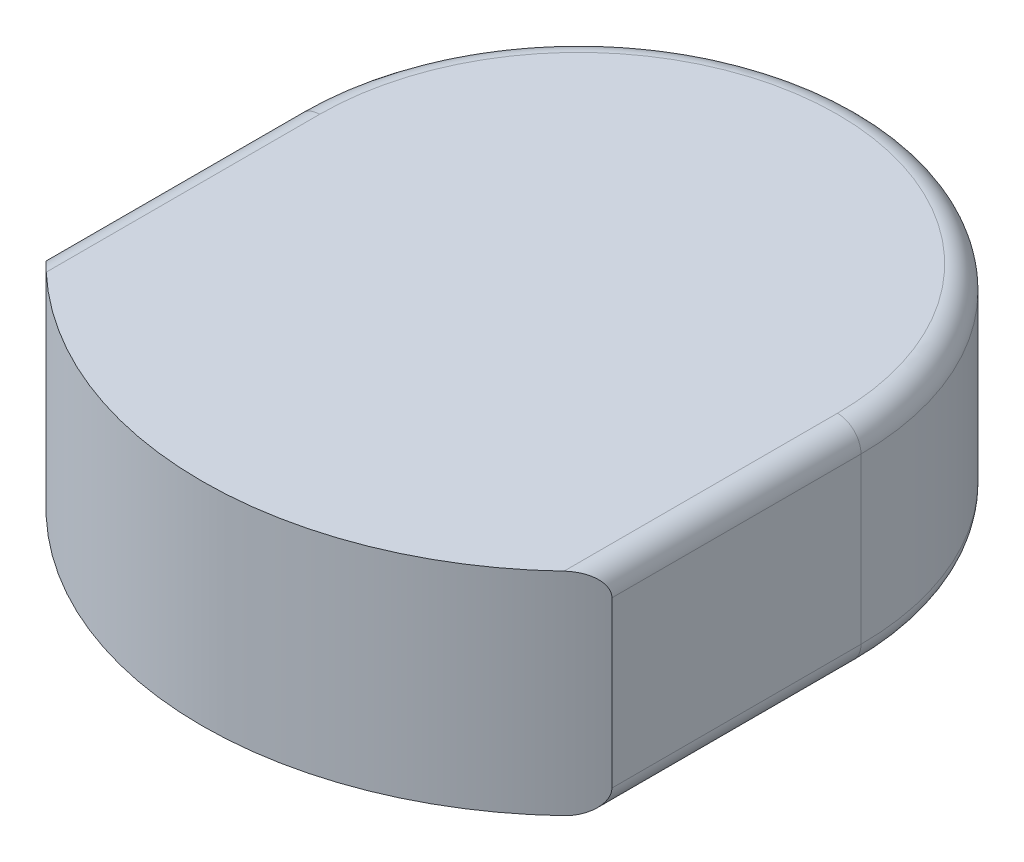
ISO-10303-21;
HEADER;
FILE_DESCRIPTION(('STEP AP214'),'2;1');
FILE_NAME('part.step','',(''),(''),'','','');
FILE_SCHEMA(('AUTOMOTIVE_DESIGN { 1 0 10303 214 1 1 1 1 }'));
ENDSEC;
DATA;
#1=APPLICATION_CONTEXT('core data for automotive mechanical design processes');
#2=APPLICATION_PROTOCOL_DEFINITION('international standard','automotive_design',2000,#1);
#3=PRODUCT_CONTEXT('',#1,'mechanical');
#4=PRODUCT('Part','Part','',(#3));
#5=PRODUCT_RELATED_PRODUCT_CATEGORY('part','',(#4));
#6=PRODUCT_DEFINITION_FORMATION('','',#4);
#7=PRODUCT_DEFINITION_CONTEXT('part definition',#1,'design');
#8=PRODUCT_DEFINITION('design','',#6,#7);
#9=PRODUCT_DEFINITION_SHAPE('','',#8);
#10=(LENGTH_UNIT() NAMED_UNIT(*) SI_UNIT(.MILLI.,.METRE.));
#11=(NAMED_UNIT(*) PLANE_ANGLE_UNIT() SI_UNIT($,.RADIAN.));
#12=(NAMED_UNIT(*) SI_UNIT($,.STERADIAN.) SOLID_ANGLE_UNIT());
#13=UNCERTAINTY_MEASURE_WITH_UNIT(LENGTH_MEASURE(1.E-05),#10,'distance_accuracy_value','');
#14=(GEOMETRIC_REPRESENTATION_CONTEXT(3) GLOBAL_UNCERTAINTY_ASSIGNED_CONTEXT((#13)) GLOBAL_UNIT_ASSIGNED_CONTEXT((#10,
#11,#12)) REPRESENTATION_CONTEXT('',''));
#15=CARTESIAN_POINT('',(0.,0.,0.));
#16=DIRECTION('',(0.,0.,1.));
#17=DIRECTION('',(1.,0.,0.));
#18=AXIS2_PLACEMENT_3D('',#15,#16,#17);
#19=CARTESIAN_POINT('',(0.,9.,-20.6522475486035));
#20=DIRECTION('',(0.,-1.,0.));
#21=DIRECTION('',(0.,0.,-1.));
#22=AXIS2_PLACEMENT_3D('',#19,#20,#21);
#23=CYLINDRICAL_SURFACE('',#22,12.);
#24=DIRECTION('',(0.,-1.,0.));
#25=VECTOR('',#24,1.);
#26=CARTESIAN_POINT('',(-12.,9.,-20.6522475486035));
#27=LINE('',#26,#25);
#28=CARTESIAN_POINT('',(-12.,8.,-20.6522475486035));
#29=VERTEX_POINT('',#28);
#30=CARTESIAN_POINT('',(-12.,0.999999999999999,-20.6522475486035));
#31=VERTEX_POINT('',#30);
#32=EDGE_CURVE('E173',#29,#31,#27,.T.);
#33=ORIENTED_EDGE('',*,*,#32,.F.);
#34=CARTESIAN_POINT('',(0.,8.,-20.6522475486035));
#35=DIRECTION('',(0.,1.,0.));
#36=DIRECTION('',(0.,0.,1.));
#37=AXIS2_PLACEMENT_3D('',#34,#35,#36);
#38=CIRCLE('',#37,12.);
#39=CARTESIAN_POINT('',(12.,8.,-20.6522475486035));
#40=VERTEX_POINT('',#39);
#41=EDGE_CURVE('E11',#29,#40,#38,.F.);
#42=ORIENTED_EDGE('',*,*,#41,.T.);
#43=DIRECTION('',(0.,-1.,0.));
#44=VECTOR('',#43,1.);
#45=CARTESIAN_POINT('',(12.,9.,-20.6522475486035));
#46=LINE('',#45,#44);
#47=CARTESIAN_POINT('',(12.,0.999999999999999,-20.6522475486035));
#48=VERTEX_POINT('',#47);
#49=EDGE_CURVE('E122',#40,#48,#46,.T.);
#50=ORIENTED_EDGE('',*,*,#49,.T.);
#51=CARTESIAN_POINT('',(0.,0.999999999999999,-20.6522475486035));
#52=DIRECTION('',(0.,1.,0.));
#53=DIRECTION('',(0.,0.,1.));
#54=AXIS2_PLACEMENT_3D('',#51,#52,#53);
#55=CIRCLE('',#54,12.);
#56=EDGE_CURVE('E43',#48,#31,#55,.T.);
#57=ORIENTED_EDGE('',*,*,#56,.T.);
#58=EDGE_LOOP('',(#33,#42,#50,#57));
#59=FACE_BOUND('',#58,.T.);
#60=ADVANCED_FACE('F33',(#59),#23,.T.);
#61=CARTESIAN_POINT('',(-12.,9.,-20.6522475486035));
#62=DIRECTION('',(1.,0.,0.));
#63=DIRECTION('',(0.,0.,-1.));
#64=AXIS2_PLACEMENT_3D('',#61,#62,#63);
#65=PLANE('',#64);
#66=DIRECTION('',(0.,-1.,0.));
#67=VECTOR('',#66,1.);
#68=CARTESIAN_POINT('',(-12.,9.,-10.0692423043451));
#69=LINE('',#68,#67);
#70=CARTESIAN_POINT('',(-12.,8.,-10.0692423043451));
#71=VERTEX_POINT('',#70);
#72=CARTESIAN_POINT('',(-12.,0.999999999999999,-10.0692423043451));
#73=VERTEX_POINT('',#72);
#74=EDGE_CURVE('E176',#71,#73,#69,.T.);
#75=ORIENTED_EDGE('',*,*,#74,.F.);
#76=DIRECTION('',(0.,0.,1.));
#77=VECTOR('',#76,1.);
#78=CARTESIAN_POINT('',(-12.,8.,-20.6522475486035));
#79=LINE('',#78,#77);
#80=EDGE_CURVE('E127',#71,#29,#79,.F.);
#81=ORIENTED_EDGE('',*,*,#80,.T.);
#82=ORIENTED_EDGE('',*,*,#32,.T.);
#83=DIRECTION('',(0.,0.,1.));
#84=VECTOR('',#83,1.);
#85=CARTESIAN_POINT('',(-12.,0.999999999999999,-20.6522475486035));
#86=LINE('',#85,#84);
#87=EDGE_CURVE('E130',#31,#73,#86,.T.);
#88=ORIENTED_EDGE('',*,*,#87,.T.);
#89=EDGE_LOOP('',(#75,#81,#82,#88));
#90=FACE_BOUND('',#89,.T.);
#91=ADVANCED_FACE('F156',(#90),#65,.F.);
#92=CARTESIAN_POINT('',(0.,9.,-20.6522475486035));
#93=DIRECTION('',(0.,-1.,0.));
#94=DIRECTION('',(0.,0.,-1.));
#95=AXIS2_PLACEMENT_3D('',#92,#93,#94);
#96=CYLINDRICAL_SURFACE('',#95,16.);
#97=DIRECTION('',(0.,-1.,0.));
#98=VECTOR('',#97,1.);
#99=CARTESIAN_POINT('',(12.,9.,-10.0692423043451));
#100=LINE('',#99,#98);
#101=CARTESIAN_POINT('',(12.,8.,-10.0692423043451));
#102=VERTEX_POINT('',#101);
#103=CARTESIAN_POINT('',(12.,0.999999999999999,-10.0692423043451));
#104=VERTEX_POINT('',#103);
#105=EDGE_CURVE('E178',#102,#104,#100,.T.);
#106=ORIENTED_EDGE('',*,*,#105,.F.);
#107=CARTESIAN_POINT('',(12.,8.,-10.0692423043451));
#108=CARTESIAN_POINT('',(12.0000035615122,8.02180551389735,-10.0692468972216));
#109=CARTESIAN_POINT('',(11.9992861508944,8.04359624395141,-10.0684328340285));
#110=CARTESIAN_POINT('',(11.9964489938103,8.08694583792304,-10.0652168650527));
#111=CARTESIAN_POINT('',(11.994330720017,8.10850492120015,-10.0628166267563));
#112=CARTESIAN_POINT('',(11.985994264631,8.17212232689589,-10.0533790318994));
#113=CARTESIAN_POINT('',(11.9777924515459,8.21361645457286,-10.0441023409964));
#114=CARTESIAN_POINT('',(11.956811023126,8.29364024924087,-10.0204596922915));
#115=CARTESIAN_POINT('',(11.9440490250663,8.33218064089815,-10.0061133224078));
#116=CARTESIAN_POINT('',(11.9147312958989,8.40601698559053,-9.97331198340421));
#117=CARTESIAN_POINT('',(11.8981648933615,8.44130341341871,-9.95484546140032));
#118=CARTESIAN_POINT('',(11.8530979373191,8.52483918231102,-9.90489083085179));
#119=CARTESIAN_POINT('',(11.8227364032559,8.57092225182701,-9.87146676209238));
#120=CARTESIAN_POINT('',(11.757176437441,8.65540374801858,-9.80000472476746));
#121=CARTESIAN_POINT('',(11.7219677469283,8.69378544006645,-9.76195699103188));
#122=CARTESIAN_POINT('',(11.6323219428844,8.77807176040455,-9.66612024490006));
#123=CARTESIAN_POINT('',(11.5760560715124,8.82027916642118,-9.60679441934037));
#124=CARTESIAN_POINT('',(11.4586530374293,8.89126314109356,-9.48504265644263));
#125=CARTESIAN_POINT('',(11.3975088295524,8.92001985806631,-9.42261228643672));
#126=CARTESIAN_POINT('',(11.2806673947765,8.96151297371666,-9.30533576020902));
#127=CARTESIAN_POINT('',(11.2254014446857,8.9759254533018,-9.25064757468383));
#128=CARTESIAN_POINT('',(11.1414510483587,8.99034945302631,-9.16879897934294));
#129=CARTESIAN_POINT('',(11.1133661753931,8.99395820891954,-9.14161665812659));
#130=CARTESIAN_POINT('',(11.0568902137106,8.99878180471099,-9.08735609089559));
#131=CARTESIAN_POINT('',(11.0284991134815,8.999996554291,-9.06027784884597));
#132=CARTESIAN_POINT('',(11.,9.,-9.03329750998125));
#133=B_SPLINE_CURVE_WITH_KNOTS('',3,(#107,#108,#109,#110,#111,#112,#113,#114,#115,#116,#117,
#118,#119,#120,#121,#122,#123,#124,#125,#126,#127,#128,#129,#130,#131,#132),.UNSPECIFIED.,.F.,
.F.,(4,2,2,2,2,2,2,2,2,2,2,2,4),(0.,0.0653620164026869,0.130655429250249,0.259780276817437,
0.388411578458895,0.517408198562907,0.709885683689213,0.902776986291516,1.17735268296256,
1.45233235322691,1.68892279777189,1.80661199484123,1.92430563186359),.UNSPECIFIED.);
#134=CARTESIAN_POINT('',(11.,9.,-9.03329750998125));
#135=VERTEX_POINT('',#134);
#136=EDGE_CURVE('E121',#102,#135,#133,.T.);
#137=ORIENTED_EDGE('',*,*,#136,.T.);
#138=CARTESIAN_POINT('',(0.,9.,-20.6522475486035));
#139=DIRECTION('',(0.,1.,0.));
#140=DIRECTION('',(0.,0.,1.));
#141=AXIS2_PLACEMENT_3D('',#138,#139,#140);
#142=CIRCLE('',#141,16.);
#143=CARTESIAN_POINT('',(-11.,9.,-9.03329750998125));
#144=VERTEX_POINT('',#143);
#145=EDGE_CURVE('E104',#144,#135,#142,.T.);
#146=ORIENTED_EDGE('',*,*,#145,.F.);
#147=CARTESIAN_POINT('',(-11.,9.,-9.03329750998125));
#148=CARTESIAN_POINT('',(-11.0387472508059,8.99998930834783,-9.0699772037462));
#149=CARTESIAN_POINT('',(-11.0773040119648,8.99774775539338,-9.10685090734731));
#150=CARTESIAN_POINT('',(-11.153811355565,8.98885378909534,-9.18074801578235));
#151=CARTESIAN_POINT('',(-11.1917615075496,8.98219837454946,-9.21777150542716));
#152=CARTESIAN_POINT('',(-11.2671026096456,8.96445100644452,-9.29200001700059));
#153=CARTESIAN_POINT('',(-11.3044858453276,8.95332104054363,-9.32920382469794));
#154=CARTESIAN_POINT('',(-11.3780668203085,8.92660498444456,-9.40314461850525));
#155=CARTESIAN_POINT('',(-11.4142650003601,8.91102057244561,-9.4398817749908));
#156=CARTESIAN_POINT('',(-11.5039431712355,8.86586916033773,-9.53175770399783));
#157=CARTESIAN_POINT('',(-11.5564657810963,8.83326294225019,-9.58637985001491));
#158=CARTESIAN_POINT('',(-11.6566243232994,8.75683530677901,-9.69193882048528));
#159=CARTESIAN_POINT('',(-11.7042755076106,8.71305049477914,-9.7428869903583));
#160=CARTESIAN_POINT('',(-11.7786309380014,8.62912632678987,-9.82331203323245));
#161=CARTESIAN_POINT('',(-11.8071825549417,8.5922426591478,-9.85447044721783));
#162=CARTESIAN_POINT('',(-11.8600206793413,8.51248961169622,-9.912534287955));
#163=CARTESIAN_POINT('',(-11.8843120271186,8.46962712549904,-9.93944453775236));
#164=CARTESIAN_POINT('',(-11.9224042923554,8.38822076963429,-9.98187246704358));
#165=CARTESIAN_POINT('',(-11.937336723917,8.35083948763389,-9.99859270764773));
#166=CARTESIAN_POINT('',(-11.9628914184713,8.27296580566934,-10.0272958858257));
#167=CARTESIAN_POINT('',(-11.9735251963102,8.23248206746229,-10.0392914771184));
#168=CARTESIAN_POINT('',(-11.9876174124883,8.15999788131863,-10.0552141976506));
#169=CARTESIAN_POINT('',(-11.9922186413768,8.12849896212978,-10.0604238253265));
#170=CARTESIAN_POINT('',(-11.9984296230293,8.06468395059426,-10.0674616353047));
#171=CARTESIAN_POINT('',(-12.0000246804198,8.0323646226872,-10.0692732063386));
#172=CARTESIAN_POINT('',(-12.,8.,-10.0692423043451));
#173=B_SPLINE_CURVE_WITH_KNOTS('',3,(#147,#148,#149,#150,#151,#152,#153,#154,#155,#156,#157,
#158,#159,#160,#161,#162,#163,#164,#165,#166,#167,#168,#169,#170,#171,#172),.UNSPECIFIED.,.F.,
.F.,(4,2,2,2,2,2,2,2,2,2,2,2,4),(0.,0.160010416689226,0.320129744056226,0.481639078313451,
0.64308764443539,0.889709334687404,1.1355335710748,1.30331534982945,1.47090525017265,
1.60118915127183,1.73112170942514,1.82757929241956,1.9245071879753),.UNSPECIFIED.);
#174=EDGE_CURVE('E118',#144,#71,#173,.T.);
#175=ORIENTED_EDGE('',*,*,#174,.T.);
#176=ORIENTED_EDGE('',*,*,#74,.T.);
#177=CARTESIAN_POINT('',(-12.,0.999999999999999,-10.0692423043451));
#178=CARTESIAN_POINT('',(-12.0000035615122,0.978194486102646,-10.0692468972216));
#179=CARTESIAN_POINT('',(-11.9992861508944,0.956403756048591,-10.0684328340285));
#180=CARTESIAN_POINT('',(-11.9964489938103,0.913054162076958,-10.0652168650527));
#181=CARTESIAN_POINT('',(-11.994330720017,0.89149507879985,-10.0628166267563));
#182=CARTESIAN_POINT('',(-11.985994264631,0.82787767310411,-10.0533790318994));
#183=CARTESIAN_POINT('',(-11.9777924515459,0.786383545427138,-10.0441023409964));
#184=CARTESIAN_POINT('',(-11.956811023126,0.706359750759123,-10.0204596922915));
#185=CARTESIAN_POINT('',(-11.9440490250663,0.667819359101849,-10.0061133224078));
#186=CARTESIAN_POINT('',(-11.9147312958989,0.593983014409466,-9.97331198340421));
#187=CARTESIAN_POINT('',(-11.8981648933615,0.558696586581288,-9.95484546140032));
#188=CARTESIAN_POINT('',(-11.8530979373191,0.475160817688979,-9.9048908308518));
#189=CARTESIAN_POINT('',(-11.8227364032559,0.429077748172985,-9.87146676209238));
#190=CARTESIAN_POINT('',(-11.757176437441,0.344596251981414,-9.80000472476746));
#191=CARTESIAN_POINT('',(-11.7219677469283,0.306214559933551,-9.76195699103188));
#192=CARTESIAN_POINT('',(-11.6323219428844,0.221928239595446,-9.66612024490006));
#193=CARTESIAN_POINT('',(-11.5760560715124,0.179720833578823,-9.60679441934037));
#194=CARTESIAN_POINT('',(-11.4586530374293,0.108736858906439,-9.48504265644262));
#195=CARTESIAN_POINT('',(-11.3975088295524,0.0799801419336909,-9.42261228643672));
#196=CARTESIAN_POINT('',(-11.2806673947765,0.0384870262833389,-9.30533576020901));
#197=CARTESIAN_POINT('',(-11.2254014446857,0.0240745466981984,-9.25064757468383));
#198=CARTESIAN_POINT('',(-11.1414510483587,0.00965054697368775,-9.16879897934294));
#199=CARTESIAN_POINT('',(-11.1133661753931,0.00604179108046068,-9.14161665812659));
#200=CARTESIAN_POINT('',(-11.0568902137106,0.00121819528900534,-9.08735609089559));
#201=CARTESIAN_POINT('',(-11.0284991134815,3.44570899888462E-06,-9.06027784884597));
#202=CARTESIAN_POINT('',(-11.,0.,-9.03329750998125));
#203=B_SPLINE_CURVE_WITH_KNOTS('',3,(#177,#178,#179,#180,#181,#182,#183,#184,#185,#186,#187,
#188,#189,#190,#191,#192,#193,#194,#195,#196,#197,#198,#199,#200,#201,#202),.UNSPECIFIED.,.F.,
.F.,(4,2,2,2,2,2,2,2,2,2,2,2,4),(0.,0.0653620164026865,0.130655429250249,0.259780276817437,
0.388411578458896,0.517408198562906,0.709885683689215,0.90277698629152,1.17735268296256,
1.45233235322691,1.68892279777189,1.80661199484123,1.92430563186358),.UNSPECIFIED.);
#204=CARTESIAN_POINT('',(-11.,0.,-9.03329750998125));
#205=VERTEX_POINT('',#204);
#206=EDGE_CURVE('E132',#73,#205,#203,.T.);
#207=ORIENTED_EDGE('',*,*,#206,.T.);
#208=CARTESIAN_POINT('',(0.,0.,-20.6522475486035));
#209=DIRECTION('',(0.,1.,0.));
#210=DIRECTION('',(0.,0.,1.));
#211=AXIS2_PLACEMENT_3D('',#208,#209,#210);
#212=CIRCLE('',#211,16.);
#213=CARTESIAN_POINT('',(11.,0.,-9.03329750998125));
#214=VERTEX_POINT('',#213);
#215=EDGE_CURVE('E123',#205,#214,#212,.T.);
#216=ORIENTED_EDGE('',*,*,#215,.T.);
#217=CARTESIAN_POINT('',(11.,0.,-9.03329750998125));
#218=CARTESIAN_POINT('',(11.0387472508059,1.06916521678251E-05,-9.0699772037462));
#219=CARTESIAN_POINT('',(11.0773040119648,0.00225224460662226,-9.10685090734731));
#220=CARTESIAN_POINT('',(11.153811355565,0.0111462109046636,-9.18074801578235));
#221=CARTESIAN_POINT('',(11.1917615075496,0.0178016254505389,-9.21777150542716));
#222=CARTESIAN_POINT('',(11.2671026096456,0.0355489935554801,-9.29200001700059));
#223=CARTESIAN_POINT('',(11.3044858453276,0.0466789594563687,-9.32920382469794));
#224=CARTESIAN_POINT('',(11.3780668203085,0.0733950155554401,-9.40314461850525));
#225=CARTESIAN_POINT('',(11.4142650003601,0.08897942755439,-9.4398817749908));
#226=CARTESIAN_POINT('',(11.5039431712355,0.134130839662268,-9.53175770399783));
#227=CARTESIAN_POINT('',(11.5564657810963,0.166737057749812,-9.58637985001492));
#228=CARTESIAN_POINT('',(11.6566243232994,0.243164693220995,-9.69193882048528));
#229=CARTESIAN_POINT('',(11.7042755076106,0.286949505220861,-9.7428869903583));
#230=CARTESIAN_POINT('',(11.7786309380014,0.370873673210132,-9.82331203323245));
#231=CARTESIAN_POINT('',(11.8071825549417,0.407757340852203,-9.85447044721783));
#232=CARTESIAN_POINT('',(11.8600206793413,0.487510388303776,-9.912534287955));
#233=CARTESIAN_POINT('',(11.8843120271186,0.53037287450095,-9.93944453775236));
#234=CARTESIAN_POINT('',(11.9224042923554,0.611779230365701,-9.98187246704359));
#235=CARTESIAN_POINT('',(11.937336723917,0.649160512366112,-9.99859270764773));
#236=CARTESIAN_POINT('',(11.9628914184713,0.727034194330656,-10.0272958858257));
#237=CARTESIAN_POINT('',(11.9735251963102,0.767517932537702,-10.0392914771184));
#238=CARTESIAN_POINT('',(11.9876174124883,0.840002118681368,-10.0552141976506));
#239=CARTESIAN_POINT('',(11.9922186413768,0.871501037870221,-10.0604238253264));
#240=CARTESIAN_POINT('',(11.9984296230293,0.935316049405735,-10.0674616353047));
#241=CARTESIAN_POINT('',(12.0000246804198,0.967635377312801,-10.0692732063386));
#242=CARTESIAN_POINT('',(12.,1.,-10.0692423043451));
#243=B_SPLINE_CURVE_WITH_KNOTS('',3,(#217,#218,#219,#220,#221,#222,#223,#224,#225,#226,#227,
#228,#229,#230,#231,#232,#233,#234,#235,#236,#237,#238,#239,#240,#241,#242),.UNSPECIFIED.,.F.,
.F.,(4,2,2,2,2,2,2,2,2,2,2,2,4),(0.,0.160010416689226,0.320129744056226,0.481639078313451,
0.643087644435391,0.889709334687405,1.1355335710748,1.30331534982945,1.47090525017264,
1.60118915127182,1.73112170942513,1.82757929241956,1.9245071879753),.UNSPECIFIED.);
#244=EDGE_CURVE('E128',#214,#104,#243,.T.);
#245=ORIENTED_EDGE('',*,*,#244,.T.);
#246=EDGE_LOOP('',(#106,#137,#146,#175,#176,#207,#216,#245));
#247=FACE_BOUND('',#246,.T.);
#248=ADVANCED_FACE('F116',(#247),#96,.T.);
#249=CARTESIAN_POINT('',(12.,9.,-20.6522475486035));
#250=DIRECTION('',(-1.,0.,0.));
#251=DIRECTION('',(0.,0.,1.));
#252=AXIS2_PLACEMENT_3D('',#249,#250,#251);
#253=PLANE('',#252);
#254=ORIENTED_EDGE('',*,*,#49,.F.);
#255=DIRECTION('',(0.,0.,-1.));
#256=VECTOR('',#255,1.);
#257=CARTESIAN_POINT('',(12.,8.,-10.0692423043451));
#258=LINE('',#257,#256);
#259=EDGE_CURVE('E166',#40,#102,#258,.F.);
#260=ORIENTED_EDGE('',*,*,#259,.T.);
#261=ORIENTED_EDGE('',*,*,#105,.T.);
#262=DIRECTION('',(0.,0.,-1.));
#263=VECTOR('',#262,1.);
#264=CARTESIAN_POINT('',(12.,0.999999999999999,-20.6522475486035));
#265=LINE('',#264,#263);
#266=EDGE_CURVE('E168',#104,#48,#265,.T.);
#267=ORIENTED_EDGE('',*,*,#266,.T.);
#268=EDGE_LOOP('',(#254,#260,#261,#267));
#269=FACE_BOUND('',#268,.T.);
#270=ADVANCED_FACE('F155',(#269),#253,.F.);
#271=CARTESIAN_POINT('',(0.,9.,-20.6522475486035));
#272=DIRECTION('',(0.,1.,0.));
#273=DIRECTION('',(0.,0.,1.));
#274=AXIS2_PLACEMENT_3D('',#271,#272,#273);
#275=PLANE('',#274);
#276=ORIENTED_EDGE('',*,*,#145,.T.);
#277=DIRECTION('',(0.,0.,-1.));
#278=VECTOR('',#277,1.);
#279=CARTESIAN_POINT('',(11.,9.,-20.6522475486035));
#280=LINE('',#279,#278);
#281=CARTESIAN_POINT('',(11.,9.,-20.6522475486035));
#282=VERTEX_POINT('',#281);
#283=EDGE_CURVE('E112',#135,#282,#280,.T.);
#284=ORIENTED_EDGE('',*,*,#283,.T.);
#285=CARTESIAN_POINT('',(0.,9.,-20.6522475486035));
#286=DIRECTION('',(0.,1.,0.));
#287=DIRECTION('',(0.,0.,1.));
#288=AXIS2_PLACEMENT_3D('',#285,#286,#287);
#289=CIRCLE('',#288,11.);
#290=CARTESIAN_POINT('',(-11.,9.,-20.6522475486035));
#291=VERTEX_POINT('',#290);
#292=EDGE_CURVE('E107',#282,#291,#289,.T.);
#293=ORIENTED_EDGE('',*,*,#292,.T.);
#294=DIRECTION('',(0.,0.,1.));
#295=VECTOR('',#294,1.);
#296=CARTESIAN_POINT('',(-11.,9.,-10.0692423043451));
#297=LINE('',#296,#295);
#298=EDGE_CURVE('E100',#291,#144,#297,.T.);
#299=ORIENTED_EDGE('',*,*,#298,.T.);
#300=EDGE_LOOP('',(#276,#284,#293,#299));
#301=FACE_BOUND('',#300,.T.);
#302=ADVANCED_FACE('F102',(#301),#275,.T.);
#303=CARTESIAN_POINT('',(0.,0.,-20.6522475486035));
#304=DIRECTION('',(0.,1.,0.));
#305=DIRECTION('',(0.,0.,1.));
#306=AXIS2_PLACEMENT_3D('',#303,#304,#305);
#307=PLANE('',#306);
#308=CARTESIAN_POINT('',(0.,0.,-20.6522475486035));
#309=DIRECTION('',(0.,1.,0.));
#310=DIRECTION('',(0.,0.,1.));
#311=AXIS2_PLACEMENT_3D('',#308,#309,#310);
#312=CIRCLE('',#311,11.);
#313=CARTESIAN_POINT('',(-11.,0.,-20.6522475486035));
#314=VERTEX_POINT('',#313);
#315=CARTESIAN_POINT('',(11.,0.,-20.6522475486035));
#316=VERTEX_POINT('',#315);
#317=EDGE_CURVE('E51',#314,#316,#312,.F.);
#318=ORIENTED_EDGE('',*,*,#317,.T.);
#319=DIRECTION('',(0.,0.,-1.));
#320=VECTOR('',#319,1.);
#321=CARTESIAN_POINT('',(11.,0.,-20.6522475486035));
#322=LINE('',#321,#320);
#323=EDGE_CURVE('E207',#316,#214,#322,.F.);
#324=ORIENTED_EDGE('',*,*,#323,.T.);
#325=ORIENTED_EDGE('',*,*,#215,.F.);
#326=DIRECTION('',(0.,0.,1.));
#327=VECTOR('',#326,1.);
#328=CARTESIAN_POINT('',(-11.,0.,-20.6522475486035));
#329=LINE('',#328,#327);
#330=EDGE_CURVE('E56',#205,#314,#329,.F.);
#331=ORIENTED_EDGE('',*,*,#330,.T.);
#332=EDGE_LOOP('',(#318,#324,#325,#331));
#333=FACE_BOUND('',#332,.T.);
#334=ADVANCED_FACE('F212',(#333),#307,.F.);
#335=CARTESIAN_POINT('',(-11.,8.,-20.6522475486035));
#336=DIRECTION('',(0.,0.,-1.));
#337=DIRECTION('',(-1.,0.,0.));
#338=AXIS2_PLACEMENT_3D('',#335,#336,#337);
#339=CYLINDRICAL_SURFACE('',#338,1.);
#340=ORIENTED_EDGE('',*,*,#174,.F.);
#341=ORIENTED_EDGE('',*,*,#298,.F.);
#342=CARTESIAN_POINT('',(-11.,8.,-20.6522475486035));
#343=DIRECTION('',(0.,0.,-1.));
#344=DIRECTION('',(-1.,0.,0.));
#345=AXIS2_PLACEMENT_3D('',#342,#343,#344);
#346=CIRCLE('',#345,1.);
#347=EDGE_CURVE('E184',#29,#291,#346,.T.);
#348=ORIENTED_EDGE('',*,*,#347,.F.);
#349=ORIENTED_EDGE('',*,*,#80,.F.);
#350=EDGE_LOOP('',(#340,#341,#348,#349));
#351=FACE_BOUND('',#350,.T.);
#352=ADVANCED_FACE('F126',(#351),#339,.T.);
#353=CARTESIAN_POINT('',(0.,8.,-20.6522475486035));
#354=DIRECTION('',(0.,1.,0.));
#355=DIRECTION('',(0.,0.,1.));
#356=AXIS2_PLACEMENT_3D('',#353,#354,#355);
#357=TOROIDAL_SURFACE('',#356,11.,1.);
#358=ORIENTED_EDGE('',*,*,#347,.T.);
#359=ORIENTED_EDGE('',*,*,#292,.F.);
#360=CARTESIAN_POINT('',(11.,8.,-20.6522475486035));
#361=DIRECTION('',(0.,0.,1.));
#362=DIRECTION('',(1.,0.,0.));
#363=AXIS2_PLACEMENT_3D('',#360,#361,#362);
#364=CIRCLE('',#363,1.);
#365=EDGE_CURVE('E186',#40,#282,#364,.T.);
#366=ORIENTED_EDGE('',*,*,#365,.F.);
#367=ORIENTED_EDGE('',*,*,#41,.F.);
#368=EDGE_LOOP('',(#358,#359,#366,#367));
#369=FACE_BOUND('',#368,.T.);
#370=ADVANCED_FACE('F219',(#369),#357,.T.);
#371=CARTESIAN_POINT('',(11.,8.,-20.6522475486035));
#372=DIRECTION('',(0.,0.,1.));
#373=DIRECTION('',(1.,0.,0.));
#374=AXIS2_PLACEMENT_3D('',#371,#372,#373);
#375=CYLINDRICAL_SURFACE('',#374,1.);
#376=ORIENTED_EDGE('',*,*,#136,.F.);
#377=ORIENTED_EDGE('',*,*,#259,.F.);
#378=ORIENTED_EDGE('',*,*,#365,.T.);
#379=ORIENTED_EDGE('',*,*,#283,.F.);
#380=EDGE_LOOP('',(#376,#377,#378,#379));
#381=FACE_BOUND('',#380,.T.);
#382=ADVANCED_FACE('F218',(#381),#375,.T.);
#383=CARTESIAN_POINT('',(-11.,0.999999999999999,-20.6522475486035));
#384=DIRECTION('',(0.,0.,1.));
#385=DIRECTION('',(1.,0.,0.));
#386=AXIS2_PLACEMENT_3D('',#383,#384,#385);
#387=CYLINDRICAL_SURFACE('',#386,1.);
#388=ORIENTED_EDGE('',*,*,#206,.F.);
#389=ORIENTED_EDGE('',*,*,#87,.F.);
#390=CARTESIAN_POINT('',(-11.,1.,-20.6522475486035));
#391=DIRECTION('',(0.,0.,-1.));
#392=DIRECTION('',(-1.,0.,0.));
#393=AXIS2_PLACEMENT_3D('',#390,#391,#392);
#394=CIRCLE('',#393,1.);
#395=EDGE_CURVE('E38',#314,#31,#394,.T.);
#396=ORIENTED_EDGE('',*,*,#395,.F.);
#397=ORIENTED_EDGE('',*,*,#330,.F.);
#398=EDGE_LOOP('',(#388,#389,#396,#397));
#399=FACE_BOUND('',#398,.T.);
#400=ADVANCED_FACE('F35',(#399),#387,.T.);
#401=CARTESIAN_POINT('',(0.,0.999999999999999,-20.6522475486035));
#402=DIRECTION('',(0.,1.,0.));
#403=DIRECTION('',(0.,0.,1.));
#404=AXIS2_PLACEMENT_3D('',#401,#402,#403);
#405=TOROIDAL_SURFACE('',#404,11.,1.);
#406=ORIENTED_EDGE('',*,*,#395,.T.);
#407=ORIENTED_EDGE('',*,*,#56,.F.);
#408=CARTESIAN_POINT('',(11.,1.,-20.6522475486035));
#409=DIRECTION('',(0.,0.,1.));
#410=DIRECTION('',(1.,0.,0.));
#411=AXIS2_PLACEMENT_3D('',#408,#409,#410);
#412=CIRCLE('',#411,1.);
#413=EDGE_CURVE('E191',#316,#48,#412,.T.);
#414=ORIENTED_EDGE('',*,*,#413,.F.);
#415=ORIENTED_EDGE('',*,*,#317,.F.);
#416=EDGE_LOOP('',(#406,#407,#414,#415));
#417=FACE_BOUND('',#416,.T.);
#418=ADVANCED_FACE('F198',(#417),#405,.T.);
#419=CARTESIAN_POINT('',(11.,0.999999999999999,-20.6522475486035));
#420=DIRECTION('',(0.,0.,-1.));
#421=DIRECTION('',(-1.,0.,0.));
#422=AXIS2_PLACEMENT_3D('',#419,#420,#421);
#423=CYLINDRICAL_SURFACE('',#422,1.);
#424=ORIENTED_EDGE('',*,*,#244,.F.);
#425=ORIENTED_EDGE('',*,*,#323,.F.);
#426=ORIENTED_EDGE('',*,*,#413,.T.);
#427=ORIENTED_EDGE('',*,*,#266,.F.);
#428=EDGE_LOOP('',(#424,#425,#426,#427));
#429=FACE_BOUND('',#428,.T.);
#430=ADVANCED_FACE('F213',(#429),#423,.T.);
#431=CLOSED_SHELL('',(#60,#91,#248,#270,#302,#334,#352,#370,#382,#400,#418,#430));
#432=MANIFOLD_SOLID_BREP('B2',#431);
#433=ADVANCED_BREP_SHAPE_REPRESENTATION('',(#18,#432),#14);
#434=SHAPE_DEFINITION_REPRESENTATION(#9,#433);
ENDSEC;
END-ISO-10303-21;
